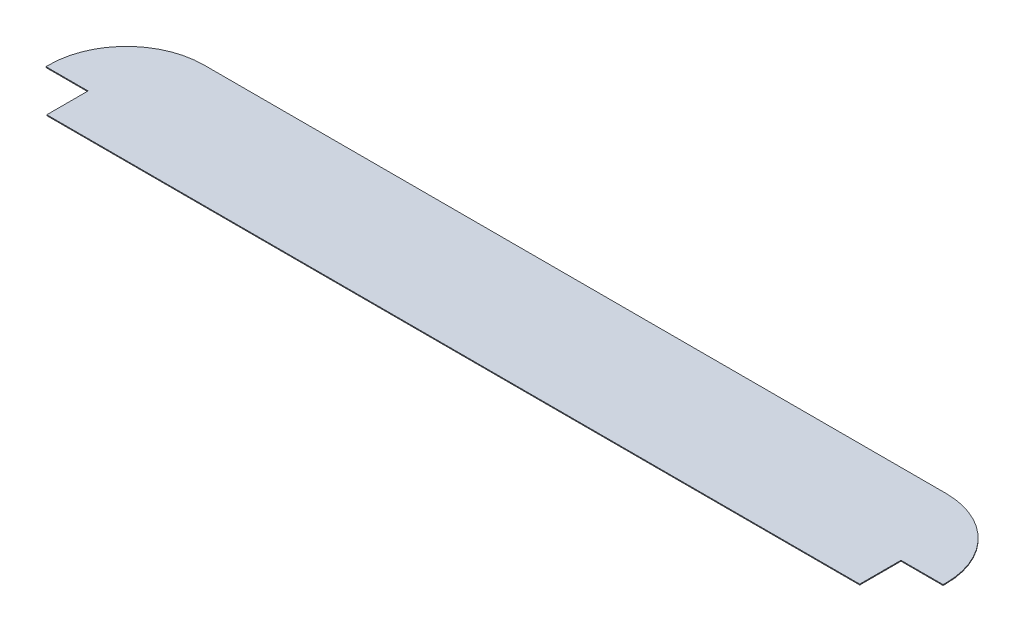
ISO-10303-21;
HEADER;
FILE_DESCRIPTION(('STEP AP214'),'2;1');
FILE_NAME('part.step','',(''),(''),'','','');
FILE_SCHEMA(('AUTOMOTIVE_DESIGN { 1 0 10303 214 1 1 1 1 }'));
ENDSEC;
DATA;
#1=APPLICATION_CONTEXT('core data for automotive mechanical design processes');
#2=APPLICATION_PROTOCOL_DEFINITION('international standard','automotive_design',2000,#1);
#3=PRODUCT_CONTEXT('',#1,'mechanical');
#4=PRODUCT('Part','Part','',(#3));
#5=PRODUCT_RELATED_PRODUCT_CATEGORY('part','',(#4));
#6=PRODUCT_DEFINITION_FORMATION('','',#4);
#7=PRODUCT_DEFINITION_CONTEXT('part definition',#1,'design');
#8=PRODUCT_DEFINITION('design','',#6,#7);
#9=PRODUCT_DEFINITION_SHAPE('','',#8);
#10=(LENGTH_UNIT() NAMED_UNIT(*) SI_UNIT(.MILLI.,.METRE.));
#11=(NAMED_UNIT(*) PLANE_ANGLE_UNIT() SI_UNIT($,.RADIAN.));
#12=(NAMED_UNIT(*) SI_UNIT($,.STERADIAN.) SOLID_ANGLE_UNIT());
#13=UNCERTAINTY_MEASURE_WITH_UNIT(LENGTH_MEASURE(1.E-05),#10,'distance_accuracy_value','');
#14=(GEOMETRIC_REPRESENTATION_CONTEXT(3) GLOBAL_UNCERTAINTY_ASSIGNED_CONTEXT((#13)) GLOBAL_UNIT_ASSIGNED_CONTEXT((#10,
#11,#12)) REPRESENTATION_CONTEXT('',''));
#15=CARTESIAN_POINT('',(0.,0.,0.));
#16=DIRECTION('',(0.,0.,1.));
#17=DIRECTION('',(1.,0.,0.));
#18=AXIS2_PLACEMENT_3D('',#15,#16,#17);
#19=CARTESIAN_POINT('',(-455.05,-0.8,59.));
#20=DIRECTION('',(-1.,0.,0.));
#21=DIRECTION('',(0.,0.,1.));
#22=AXIS2_PLACEMENT_3D('',#19,#20,#21);
#23=PLANE('',#22);
#24=DIRECTION('',(0.,0.,1.));
#25=VECTOR('',#24,1.);
#26=CARTESIAN_POINT('',(-455.05,0.,59.));
#27=LINE('',#26,#25);
#28=CARTESIAN_POINT('',(-455.05,0.,19.));
#29=VERTEX_POINT('',#28);
#30=CARTESIAN_POINT('',(-455.05,0.,59.));
#31=VERTEX_POINT('',#30);
#32=EDGE_CURVE('E143',#29,#31,#27,.T.);
#33=ORIENTED_EDGE('',*,*,#32,.F.);
#34=DIRECTION('',(0.,1.,0.));
#35=VECTOR('',#34,1.);
#36=CARTESIAN_POINT('',(-455.05,-0.8,19.));
#37=LINE('',#36,#35);
#38=CARTESIAN_POINT('',(-455.05,-0.8,19.));
#39=VERTEX_POINT('',#38);
#40=EDGE_CURVE('E11',#39,#29,#37,.T.);
#41=ORIENTED_EDGE('',*,*,#40,.F.);
#42=DIRECTION('',(0.,0.,1.));
#43=VECTOR('',#42,1.);
#44=CARTESIAN_POINT('',(-455.05,-0.8,59.));
#45=LINE('',#44,#43);
#46=CARTESIAN_POINT('',(-455.05,-0.8,59.));
#47=VERTEX_POINT('',#46);
#48=EDGE_CURVE('E169',#39,#47,#45,.T.);
#49=ORIENTED_EDGE('',*,*,#48,.T.);
#50=DIRECTION('',(0.,1.,0.));
#51=VECTOR('',#50,1.);
#52=CARTESIAN_POINT('',(-455.05,-0.8,59.));
#53=LINE('',#52,#51);
#54=EDGE_CURVE('E37',#47,#31,#53,.T.);
#55=ORIENTED_EDGE('',*,*,#54,.T.);
#56=EDGE_LOOP('',(#33,#41,#49,#55));
#57=FACE_BOUND('',#56,.T.);
#58=ADVANCED_FACE('F34',(#57),#23,.T.);
#59=CARTESIAN_POINT('',(-495.85,-0.8,19.));
#60=DIRECTION('',(0.,0.,1.));
#61=DIRECTION('',(1.,0.,0.));
#62=AXIS2_PLACEMENT_3D('',#59,#60,#61);
#63=PLANE('',#62);
#64=DIRECTION('',(1.,0.,0.));
#65=VECTOR('',#64,1.);
#66=CARTESIAN_POINT('',(-495.85,0.,19.));
#67=LINE('',#66,#65);
#68=CARTESIAN_POINT('',(-495.85,0.,19.));
#69=VERTEX_POINT('',#68);
#70=EDGE_CURVE('E167',#69,#29,#67,.T.);
#71=ORIENTED_EDGE('',*,*,#70,.F.);
#72=DIRECTION('',(0.,1.,0.));
#73=VECTOR('',#72,1.);
#74=CARTESIAN_POINT('',(-495.85,-0.8,19.));
#75=LINE('',#74,#73);
#76=CARTESIAN_POINT('',(-495.85,-0.8,19.));
#77=VERTEX_POINT('',#76);
#78=EDGE_CURVE('E43',#77,#69,#75,.T.);
#79=ORIENTED_EDGE('',*,*,#78,.F.);
#80=DIRECTION('',(1.,0.,0.));
#81=VECTOR('',#80,1.);
#82=CARTESIAN_POINT('',(-495.85,-0.8,19.));
#83=LINE('',#82,#81);
#84=EDGE_CURVE('E133',#77,#39,#83,.T.);
#85=ORIENTED_EDGE('',*,*,#84,.T.);
#86=ORIENTED_EDGE('',*,*,#40,.T.);
#87=EDGE_LOOP('',(#71,#79,#85,#86));
#88=FACE_BOUND('',#87,.T.);
#89=ADVANCED_FACE('F185',(#88),#63,.T.);
#90=CARTESIAN_POINT('',(-495.85,-0.8,19.));
#91=DIRECTION('',(-1.,0.,0.));
#92=DIRECTION('',(0.,0.,1.));
#93=AXIS2_PLACEMENT_3D('',#90,#91,#92);
#94=PLANE('',#93);
#95=DIRECTION('',(0.,0.,1.));
#96=VECTOR('',#95,1.);
#97=CARTESIAN_POINT('',(-495.85,0.,19.));
#98=LINE('',#97,#96);
#99=CARTESIAN_POINT('',(-495.85,0.,16.));
#100=VERTEX_POINT('',#99);
#101=EDGE_CURVE('E120',#100,#69,#98,.T.);
#102=ORIENTED_EDGE('',*,*,#101,.F.);
#103=DIRECTION('',(0.,1.,0.));
#104=VECTOR('',#103,1.);
#105=CARTESIAN_POINT('',(-495.85,-0.8,16.));
#106=LINE('',#105,#104);
#107=CARTESIAN_POINT('',(-495.85,-0.8,16.));
#108=VERTEX_POINT('',#107);
#109=EDGE_CURVE('E115',#108,#100,#106,.T.);
#110=ORIENTED_EDGE('',*,*,#109,.F.);
#111=DIRECTION('',(0.,0.,1.));
#112=VECTOR('',#111,1.);
#113=CARTESIAN_POINT('',(-495.85,-0.8,19.));
#114=LINE('',#113,#112);
#115=EDGE_CURVE('E118',#108,#77,#114,.T.);
#116=ORIENTED_EDGE('',*,*,#115,.T.);
#117=ORIENTED_EDGE('',*,*,#78,.T.);
#118=EDGE_LOOP('',(#102,#110,#116,#117));
#119=FACE_BOUND('',#118,.T.);
#120=ADVANCED_FACE('F117',(#119),#94,.T.);
#121=CARTESIAN_POINT('',(-420.85,-0.8,16.));
#122=DIRECTION('',(0.,1.,0.));
#123=DIRECTION('',(0.,0.,1.));
#124=AXIS2_PLACEMENT_3D('',#121,#122,#123);
#125=CYLINDRICAL_SURFACE('',#124,75.);
#126=CARTESIAN_POINT('',(-420.85,0.,16.));
#127=DIRECTION('',(0.,1.,0.));
#128=DIRECTION('',(0.,0.,-1.));
#129=AXIS2_PLACEMENT_3D('',#126,#127,#128);
#130=CIRCLE('',#129,75.);
#131=CARTESIAN_POINT('',(-420.85,0.,-59.));
#132=VERTEX_POINT('',#131);
#133=EDGE_CURVE('E164',#132,#100,#130,.T.);
#134=ORIENTED_EDGE('',*,*,#133,.F.);
#135=DIRECTION('',(0.,1.,0.));
#136=VECTOR('',#135,1.);
#137=CARTESIAN_POINT('',(-420.85,-0.8,-59.));
#138=LINE('',#137,#136);
#139=CARTESIAN_POINT('',(-420.85,-0.8,-59.));
#140=VERTEX_POINT('',#139);
#141=EDGE_CURVE('E125',#140,#132,#138,.T.);
#142=ORIENTED_EDGE('',*,*,#141,.F.);
#143=CARTESIAN_POINT('',(-420.85,-0.8,16.));
#144=DIRECTION('',(0.,1.,0.));
#145=DIRECTION('',(0.,0.,-1.));
#146=AXIS2_PLACEMENT_3D('',#143,#144,#145);
#147=CIRCLE('',#146,75.);
#148=EDGE_CURVE('E131',#140,#108,#147,.T.);
#149=ORIENTED_EDGE('',*,*,#148,.T.);
#150=ORIENTED_EDGE('',*,*,#109,.T.);
#151=EDGE_LOOP('',(#134,#142,#149,#150));
#152=FACE_BOUND('',#151,.T.);
#153=ADVANCED_FACE('F135',(#152),#125,.T.);
#154=CARTESIAN_POINT('',(-420.85,-0.8,-59.));
#155=DIRECTION('',(0.,0.,-1.));
#156=DIRECTION('',(-1.,0.,0.));
#157=AXIS2_PLACEMENT_3D('',#154,#155,#156);
#158=PLANE('',#157);
#159=DIRECTION('',(-1.,0.,0.));
#160=VECTOR('',#159,1.);
#161=CARTESIAN_POINT('',(-420.85,0.,-59.));
#162=LINE('',#161,#160);
#163=CARTESIAN_POINT('',(299.15,0.,-59.));
#164=VERTEX_POINT('',#163);
#165=EDGE_CURVE('E161',#164,#132,#162,.T.);
#166=ORIENTED_EDGE('',*,*,#165,.F.);
#167=DIRECTION('',(0.,1.,0.));
#168=VECTOR('',#167,1.);
#169=CARTESIAN_POINT('',(299.15,-0.8,-59.));
#170=LINE('',#169,#168);
#171=CARTESIAN_POINT('',(299.15,-0.8,-59.));
#172=VERTEX_POINT('',#171);
#173=EDGE_CURVE('E173',#172,#164,#170,.T.);
#174=ORIENTED_EDGE('',*,*,#173,.F.);
#175=DIRECTION('',(-1.,0.,0.));
#176=VECTOR('',#175,1.);
#177=CARTESIAN_POINT('',(-420.85,-0.8,-59.));
#178=LINE('',#177,#176);
#179=EDGE_CURVE('E136',#172,#140,#178,.T.);
#180=ORIENTED_EDGE('',*,*,#179,.T.);
#181=ORIENTED_EDGE('',*,*,#141,.T.);
#182=EDGE_LOOP('',(#166,#174,#180,#181));
#183=FACE_BOUND('',#182,.T.);
#184=ADVANCED_FACE('F198',(#183),#158,.T.);
#185=CARTESIAN_POINT('',(299.15,-0.8,16.));
#186=DIRECTION('',(0.,1.,0.));
#187=DIRECTION('',(0.,0.,1.));
#188=AXIS2_PLACEMENT_3D('',#185,#186,#187);
#189=CYLINDRICAL_SURFACE('',#188,75.);
#190=CARTESIAN_POINT('',(299.15,0.,16.));
#191=DIRECTION('',(0.,1.,0.));
#192=DIRECTION('',(0.,0.,-1.));
#193=AXIS2_PLACEMENT_3D('',#190,#191,#192);
#194=CIRCLE('',#193,75.);
#195=CARTESIAN_POINT('',(374.15,0.,16.));
#196=VERTEX_POINT('',#195);
#197=EDGE_CURVE('E158',#196,#164,#194,.T.);
#198=ORIENTED_EDGE('',*,*,#197,.F.);
#199=DIRECTION('',(0.,1.,0.));
#200=VECTOR('',#199,1.);
#201=CARTESIAN_POINT('',(374.15,-0.8,16.));
#202=LINE('',#201,#200);
#203=CARTESIAN_POINT('',(374.15,-0.8,16.));
#204=VERTEX_POINT('',#203);
#205=EDGE_CURVE('E175',#204,#196,#202,.T.);
#206=ORIENTED_EDGE('',*,*,#205,.F.);
#207=CARTESIAN_POINT('',(299.15,-0.8,16.));
#208=DIRECTION('',(0.,1.,0.));
#209=DIRECTION('',(0.,0.,-1.));
#210=AXIS2_PLACEMENT_3D('',#207,#208,#209);
#211=CIRCLE('',#210,75.);
#212=EDGE_CURVE('E138',#204,#172,#211,.T.);
#213=ORIENTED_EDGE('',*,*,#212,.T.);
#214=ORIENTED_EDGE('',*,*,#173,.T.);
#215=EDGE_LOOP('',(#198,#206,#213,#214));
#216=FACE_BOUND('',#215,.T.);
#217=ADVANCED_FACE('F201',(#216),#189,.T.);
#218=CARTESIAN_POINT('',(374.15,-0.8,19.));
#219=DIRECTION('',(1.,0.,0.));
#220=DIRECTION('',(0.,0.,-1.));
#221=AXIS2_PLACEMENT_3D('',#218,#219,#220);
#222=PLANE('',#221);
#223=DIRECTION('',(0.,0.,-1.));
#224=VECTOR('',#223,1.);
#225=CARTESIAN_POINT('',(374.15,0.,19.));
#226=LINE('',#225,#224);
#227=CARTESIAN_POINT('',(374.15,0.,19.));
#228=VERTEX_POINT('',#227);
#229=EDGE_CURVE('E155',#228,#196,#226,.T.);
#230=ORIENTED_EDGE('',*,*,#229,.F.);
#231=DIRECTION('',(0.,1.,0.));
#232=VECTOR('',#231,1.);
#233=CARTESIAN_POINT('',(374.15,-0.8,19.));
#234=LINE('',#233,#232);
#235=CARTESIAN_POINT('',(374.15,-0.8,19.));
#236=VERTEX_POINT('',#235);
#237=EDGE_CURVE('E177',#236,#228,#234,.T.);
#238=ORIENTED_EDGE('',*,*,#237,.F.);
#239=DIRECTION('',(0.,0.,-1.));
#240=VECTOR('',#239,1.);
#241=CARTESIAN_POINT('',(374.15,-0.8,19.));
#242=LINE('',#241,#240);
#243=EDGE_CURVE('E324',#236,#204,#242,.T.);
#244=ORIENTED_EDGE('',*,*,#243,.T.);
#245=ORIENTED_EDGE('',*,*,#205,.T.);
#246=EDGE_LOOP('',(#230,#238,#244,#245));
#247=FACE_BOUND('',#246,.T.);
#248=ADVANCED_FACE('F205',(#247),#222,.T.);
#249=CARTESIAN_POINT('',(374.15,-0.8,19.));
#250=DIRECTION('',(0.,0.,1.));
#251=DIRECTION('',(1.,0.,0.));
#252=AXIS2_PLACEMENT_3D('',#249,#250,#251);
#253=PLANE('',#252);
#254=DIRECTION('',(1.,0.,0.));
#255=VECTOR('',#254,1.);
#256=CARTESIAN_POINT('',(374.15,0.,19.));
#257=LINE('',#256,#255);
#258=CARTESIAN_POINT('',(333.35,0.,19.));
#259=VERTEX_POINT('',#258);
#260=EDGE_CURVE('E152',#259,#228,#257,.T.);
#261=ORIENTED_EDGE('',*,*,#260,.F.);
#262=DIRECTION('',(0.,1.,0.));
#263=VECTOR('',#262,1.);
#264=CARTESIAN_POINT('',(333.35,-0.8,19.));
#265=LINE('',#264,#263);
#266=CARTESIAN_POINT('',(333.35,-0.8,19.));
#267=VERTEX_POINT('',#266);
#268=EDGE_CURVE('E179',#267,#259,#265,.T.);
#269=ORIENTED_EDGE('',*,*,#268,.F.);
#270=DIRECTION('',(1.,0.,0.));
#271=VECTOR('',#270,1.);
#272=CARTESIAN_POINT('',(374.15,-0.8,19.));
#273=LINE('',#272,#271);
#274=EDGE_CURVE('E320',#267,#236,#273,.T.);
#275=ORIENTED_EDGE('',*,*,#274,.T.);
#276=ORIENTED_EDGE('',*,*,#237,.T.);
#277=EDGE_LOOP('',(#261,#269,#275,#276));
#278=FACE_BOUND('',#277,.T.);
#279=ADVANCED_FACE('F209',(#278),#253,.T.);
#280=CARTESIAN_POINT('',(333.35,-0.8,59.));
#281=DIRECTION('',(1.,0.,0.));
#282=DIRECTION('',(0.,0.,-1.));
#283=AXIS2_PLACEMENT_3D('',#280,#281,#282);
#284=PLANE('',#283);
#285=DIRECTION('',(0.,0.,-1.));
#286=VECTOR('',#285,1.);
#287=CARTESIAN_POINT('',(333.35,0.,59.));
#288=LINE('',#287,#286);
#289=CARTESIAN_POINT('',(333.35,0.,59.));
#290=VERTEX_POINT('',#289);
#291=EDGE_CURVE('E149',#290,#259,#288,.T.);
#292=ORIENTED_EDGE('',*,*,#291,.F.);
#293=DIRECTION('',(0.,1.,0.));
#294=VECTOR('',#293,1.);
#295=CARTESIAN_POINT('',(333.35,-0.8,59.));
#296=LINE('',#295,#294);
#297=CARTESIAN_POINT('',(333.35,-0.8,59.));
#298=VERTEX_POINT('',#297);
#299=EDGE_CURVE('E180',#298,#290,#296,.T.);
#300=ORIENTED_EDGE('',*,*,#299,.F.);
#301=DIRECTION('',(0.,0.,-1.));
#302=VECTOR('',#301,1.);
#303=CARTESIAN_POINT('',(333.35,-0.8,59.));
#304=LINE('',#303,#302);
#305=EDGE_CURVE('E331',#298,#267,#304,.T.);
#306=ORIENTED_EDGE('',*,*,#305,.T.);
#307=ORIENTED_EDGE('',*,*,#268,.T.);
#308=EDGE_LOOP('',(#292,#300,#306,#307));
#309=FACE_BOUND('',#308,.T.);
#310=ADVANCED_FACE('F213',(#309),#284,.T.);
#311=CARTESIAN_POINT('',(-455.05,-0.8,59.));
#312=DIRECTION('',(0.,0.,1.));
#313=DIRECTION('',(1.,0.,0.));
#314=AXIS2_PLACEMENT_3D('',#311,#312,#313);
#315=PLANE('',#314);
#316=DIRECTION('',(1.,0.,0.));
#317=VECTOR('',#316,1.);
#318=CARTESIAN_POINT('',(-455.05,0.,59.));
#319=LINE('',#318,#317);
#320=EDGE_CURVE('E146',#31,#290,#319,.T.);
#321=ORIENTED_EDGE('',*,*,#320,.F.);
#322=ORIENTED_EDGE('',*,*,#54,.F.);
#323=DIRECTION('',(1.,0.,0.));
#324=VECTOR('',#323,1.);
#325=CARTESIAN_POINT('',(-455.05,-0.8,59.));
#326=LINE('',#325,#324);
#327=EDGE_CURVE('E333',#47,#298,#326,.T.);
#328=ORIENTED_EDGE('',*,*,#327,.T.);
#329=ORIENTED_EDGE('',*,*,#299,.T.);
#330=EDGE_LOOP('',(#321,#322,#328,#329));
#331=FACE_BOUND('',#330,.T.);
#332=ADVANCED_FACE('F182',(#331),#315,.T.);
#333=CARTESIAN_POINT('',(-420.85,-0.8,16.));
#334=DIRECTION('',(0.,-1.,0.));
#335=DIRECTION('',(0.,0.,-1.));
#336=AXIS2_PLACEMENT_3D('',#333,#334,#335);
#337=PLANE('',#336);
#338=ORIENTED_EDGE('',*,*,#48,.F.);
#339=ORIENTED_EDGE('',*,*,#84,.F.);
#340=ORIENTED_EDGE('',*,*,#115,.F.);
#341=ORIENTED_EDGE('',*,*,#148,.F.);
#342=ORIENTED_EDGE('',*,*,#179,.F.);
#343=ORIENTED_EDGE('',*,*,#212,.F.);
#344=ORIENTED_EDGE('',*,*,#243,.F.);
#345=ORIENTED_EDGE('',*,*,#274,.F.);
#346=ORIENTED_EDGE('',*,*,#305,.F.);
#347=ORIENTED_EDGE('',*,*,#327,.F.);
#348=EDGE_LOOP('',(#338,#339,#340,#341,#342,#343,#344,#345,#346,#347));
#349=FACE_BOUND('',#348,.T.);
#350=ADVANCED_FACE('F129',(#349),#337,.T.);
#351=CARTESIAN_POINT('',(-420.85,0.,16.));
#352=DIRECTION('',(0.,-1.,0.));
#353=DIRECTION('',(0.,0.,-1.));
#354=AXIS2_PLACEMENT_3D('',#351,#352,#353);
#355=PLANE('',#354);
#356=ORIENTED_EDGE('',*,*,#32,.T.);
#357=ORIENTED_EDGE('',*,*,#320,.T.);
#358=ORIENTED_EDGE('',*,*,#291,.T.);
#359=ORIENTED_EDGE('',*,*,#260,.T.);
#360=ORIENTED_EDGE('',*,*,#229,.T.);
#361=ORIENTED_EDGE('',*,*,#197,.T.);
#362=ORIENTED_EDGE('',*,*,#165,.T.);
#363=ORIENTED_EDGE('',*,*,#133,.T.);
#364=ORIENTED_EDGE('',*,*,#101,.T.);
#365=ORIENTED_EDGE('',*,*,#70,.T.);
#366=EDGE_LOOP('',(#356,#357,#358,#359,#360,#361,#362,#363,#364,#365));
#367=FACE_BOUND('',#366,.T.);
#368=ADVANCED_FACE('F184',(#367),#355,.F.);
#369=CLOSED_SHELL('',(#58,#89,#120,#153,#184,#217,#248,#279,#310,#332,#350,#368));
#370=MANIFOLD_SOLID_BREP('B2',#369);
#371=ADVANCED_BREP_SHAPE_REPRESENTATION('',(#18,#370),#14);
#372=SHAPE_DEFINITION_REPRESENTATION(#9,#371);
ENDSEC;
END-ISO-10303-21;
